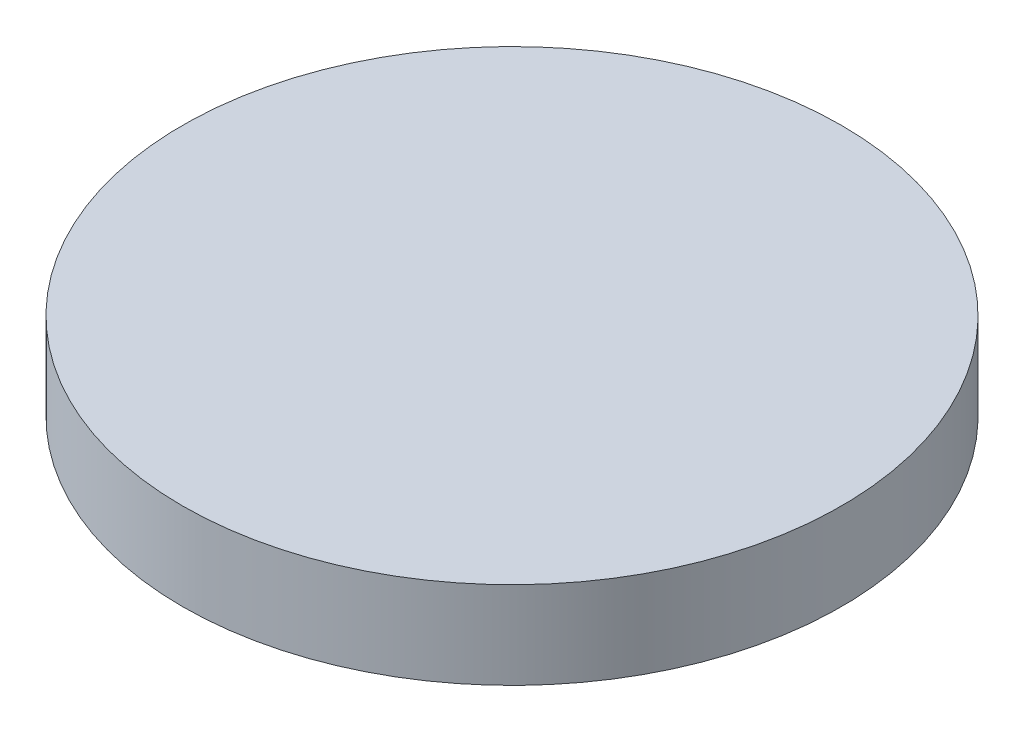
ISO-10303-21;
HEADER;
FILE_DESCRIPTION(('STEP AP214'),'2;1');
FILE_NAME('part.step','',(''),(''),'','','');
FILE_SCHEMA(('AUTOMOTIVE_DESIGN { 1 0 10303 214 1 1 1 1 }'));
ENDSEC;
DATA;
#1=APPLICATION_CONTEXT('core data for automotive mechanical design processes');
#2=APPLICATION_PROTOCOL_DEFINITION('international standard','automotive_design',2000,#1);
#3=PRODUCT_CONTEXT('',#1,'mechanical');
#4=PRODUCT('Part','Part','',(#3));
#5=PRODUCT_RELATED_PRODUCT_CATEGORY('part','',(#4));
#6=PRODUCT_DEFINITION_FORMATION('','',#4);
#7=PRODUCT_DEFINITION_CONTEXT('part definition',#1,'design');
#8=PRODUCT_DEFINITION('design','',#6,#7);
#9=PRODUCT_DEFINITION_SHAPE('','',#8);
#10=(LENGTH_UNIT() NAMED_UNIT(*) SI_UNIT(.MILLI.,.METRE.));
#11=(NAMED_UNIT(*) PLANE_ANGLE_UNIT() SI_UNIT($,.RADIAN.));
#12=(NAMED_UNIT(*) SI_UNIT($,.STERADIAN.) SOLID_ANGLE_UNIT());
#13=UNCERTAINTY_MEASURE_WITH_UNIT(LENGTH_MEASURE(1.E-05),#10,'distance_accuracy_value','');
#14=(GEOMETRIC_REPRESENTATION_CONTEXT(3) GLOBAL_UNCERTAINTY_ASSIGNED_CONTEXT((#13)) GLOBAL_UNIT_ASSIGNED_CONTEXT((#10,
#11,#12)) REPRESENTATION_CONTEXT('',''));
#15=CARTESIAN_POINT('',(0.,0.,0.));
#16=DIRECTION('',(0.,0.,1.));
#17=DIRECTION('',(1.,0.,0.));
#18=AXIS2_PLACEMENT_3D('',#15,#16,#17);
#19=CARTESIAN_POINT('',(0.908753238835547,10.,0.));
#20=DIRECTION('',(0.,-1.,0.));
#21=DIRECTION('',(0.,0.,-1.));
#22=AXIS2_PLACEMENT_3D('',#19,#20,#21);
#23=CYLINDRICAL_SURFACE('',#22,37.777278100094);
#24=CARTESIAN_POINT('',(0.908753238835547,10.,0.));
#25=DIRECTION('',(0.,1.,0.));
#26=DIRECTION('',(0.,0.,1.));
#27=AXIS2_PLACEMENT_3D('',#24,#25,#26);
#28=CIRCLE('',#27,37.777278100094);
#29=CARTESIAN_POINT('',(0.908753238835547,10.,37.777278100094));
#30=VERTEX_POINT('',#29);
#31=EDGE_CURVE('E10',#30,#30,#28,.T.);
#32=ORIENTED_EDGE('',*,*,#31,.F.);
#33=EDGE_LOOP('',(#32));
#34=FACE_BOUND('',#33,.T.);
#35=CARTESIAN_POINT('',(0.908753238835547,0.,0.));
#36=DIRECTION('',(0.,1.,0.));
#37=DIRECTION('',(0.,0.,1.));
#38=AXIS2_PLACEMENT_3D('',#35,#36,#37);
#39=CIRCLE('',#38,37.777278100094);
#40=CARTESIAN_POINT('',(0.908753238835547,0.,37.777278100094));
#41=VERTEX_POINT('',#40);
#42=EDGE_CURVE('E34',#41,#41,#39,.T.);
#43=ORIENTED_EDGE('',*,*,#42,.T.);
#44=EDGE_LOOP('',(#43));
#45=FACE_BOUND('',#44,.T.);
#46=ADVANCED_FACE('F31',(#34,#45),#23,.T.);
#47=CARTESIAN_POINT('',(0.908753238835547,10.,0.));
#48=DIRECTION('',(0.,1.,0.));
#49=DIRECTION('',(0.,0.,1.));
#50=AXIS2_PLACEMENT_3D('',#47,#48,#49);
#51=PLANE('',#50);
#52=ORIENTED_EDGE('',*,*,#31,.T.);
#53=EDGE_LOOP('',(#52));
#54=FACE_BOUND('',#53,.T.);
#55=ADVANCED_FACE('F46',(#54),#51,.T.);
#56=CARTESIAN_POINT('',(0.908753238835547,0.,0.));
#57=DIRECTION('',(0.,1.,0.));
#58=DIRECTION('',(0.,0.,1.));
#59=AXIS2_PLACEMENT_3D('',#56,#57,#58);
#60=PLANE('',#59);
#61=ORIENTED_EDGE('',*,*,#42,.F.);
#62=EDGE_LOOP('',(#61));
#63=FACE_BOUND('',#62,.T.);
#64=ADVANCED_FACE('F44',(#63),#60,.F.);
#65=CLOSED_SHELL('',(#46,#55,#64));
#66=MANIFOLD_SOLID_BREP('B2',#65);
#67=ADVANCED_BREP_SHAPE_REPRESENTATION('',(#18,#66),#14);
#68=SHAPE_DEFINITION_REPRESENTATION(#9,#67);
ENDSEC;
END-ISO-10303-21;
